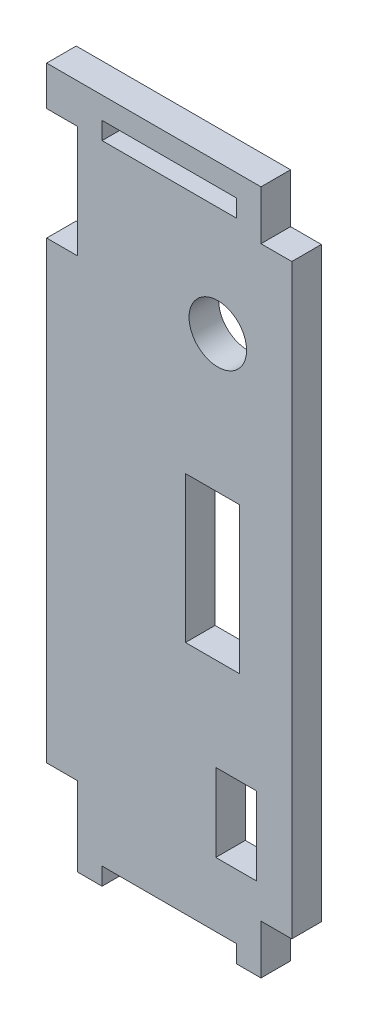
ISO-10303-21;
HEADER;
FILE_DESCRIPTION(('STEP AP214'),'2;1');
FILE_NAME('part.step','',(''),(''),'','','');
FILE_SCHEMA(('AUTOMOTIVE_DESIGN { 1 0 10303 214 1 1 1 1 }'));
ENDSEC;
DATA;
#1=APPLICATION_CONTEXT('core data for automotive mechanical design processes');
#2=APPLICATION_PROTOCOL_DEFINITION('international standard','automotive_design',2000,#1);
#3=PRODUCT_CONTEXT('',#1,'mechanical');
#4=PRODUCT('Part','Part','',(#3));
#5=PRODUCT_RELATED_PRODUCT_CATEGORY('part','',(#4));
#6=PRODUCT_DEFINITION_FORMATION('','',#4);
#7=PRODUCT_DEFINITION_CONTEXT('part definition',#1,'design');
#8=PRODUCT_DEFINITION('design','',#6,#7);
#9=PRODUCT_DEFINITION_SHAPE('','',#8);
#10=(LENGTH_UNIT() NAMED_UNIT(*) SI_UNIT(.MILLI.,.METRE.));
#11=(NAMED_UNIT(*) PLANE_ANGLE_UNIT() SI_UNIT($,.RADIAN.));
#12=(NAMED_UNIT(*) SI_UNIT($,.STERADIAN.) SOLID_ANGLE_UNIT());
#13=UNCERTAINTY_MEASURE_WITH_UNIT(LENGTH_MEASURE(1.E-05),#10,'distance_accuracy_value','');
#14=(GEOMETRIC_REPRESENTATION_CONTEXT(3) GLOBAL_UNCERTAINTY_ASSIGNED_CONTEXT((#13)) GLOBAL_UNIT_ASSIGNED_CONTEXT((#10,
#11,#12)) REPRESENTATION_CONTEXT('',''));
#15=CARTESIAN_POINT('',(0.,0.,0.));
#16=DIRECTION('',(0.,0.,1.));
#17=DIRECTION('',(1.,0.,0.));
#18=AXIS2_PLACEMENT_3D('',#15,#16,#17);
#19=CARTESIAN_POINT('',(19.558,0.,3.048));
#20=DIRECTION('',(-1.,0.,0.));
#21=DIRECTION('',(0.,0.,1.));
#22=AXIS2_PLACEMENT_3D('',#19,#20,#21);
#23=PLANE('',#22);
#24=DIRECTION('',(0.,1.,0.));
#25=VECTOR('',#24,1.);
#26=CARTESIAN_POINT('',(19.558,0.,0.));
#27=LINE('',#26,#25);
#28=CARTESIAN_POINT('',(19.558,64.77,0.));
#29=VERTEX_POINT('',#28);
#30=CARTESIAN_POINT('',(19.558,66.5734,0.));
#31=VERTEX_POINT('',#30);
#32=EDGE_CURVE('E331',#29,#31,#27,.T.);
#33=ORIENTED_EDGE('',*,*,#32,.F.);
#34=DIRECTION('',(0.,0.,-1.));
#35=VECTOR('',#34,1.);
#36=CARTESIAN_POINT('',(19.558,64.77,3.048));
#37=LINE('',#36,#35);
#38=CARTESIAN_POINT('',(19.558,64.77,3.048));
#39=VERTEX_POINT('',#38);
#40=EDGE_CURVE('E11',#39,#29,#37,.T.);
#41=ORIENTED_EDGE('',*,*,#40,.F.);
#42=DIRECTION('',(0.,1.,0.));
#43=VECTOR('',#42,1.);
#44=CARTESIAN_POINT('',(19.558,0.,3.048));
#45=LINE('',#44,#43);
#46=CARTESIAN_POINT('',(19.558,66.5734,3.048));
#47=VERTEX_POINT('',#46);
#48=EDGE_CURVE('E258',#39,#47,#45,.T.);
#49=ORIENTED_EDGE('',*,*,#48,.T.);
#50=DIRECTION('',(0.,0.,-1.));
#51=VECTOR('',#50,1.);
#52=CARTESIAN_POINT('',(19.558,66.5734,3.048));
#53=LINE('',#52,#51);
#54=EDGE_CURVE('E153',#47,#31,#53,.T.);
#55=ORIENTED_EDGE('',*,*,#54,.T.);
#56=EDGE_LOOP('',(#33,#41,#49,#55));
#57=FACE_BOUND('',#56,.T.);
#58=ADVANCED_FACE('F33',(#57),#23,.T.);
#59=CARTESIAN_POINT('',(0.,64.77,3.048));
#60=DIRECTION('',(0.,1.,0.));
#61=DIRECTION('',(0.,0.,1.));
#62=AXIS2_PLACEMENT_3D('',#59,#60,#61);
#63=PLANE('',#62);
#64=DIRECTION('',(1.,0.,0.));
#65=VECTOR('',#64,1.);
#66=CARTESIAN_POINT('',(0.,64.77,0.));
#67=LINE('',#66,#65);
#68=CARTESIAN_POINT('',(5.71499999999999,64.77,0.));
#69=VERTEX_POINT('',#68);
#70=EDGE_CURVE('E248',#69,#29,#67,.T.);
#71=ORIENTED_EDGE('',*,*,#70,.F.);
#72=DIRECTION('',(0.,0.,-1.));
#73=VECTOR('',#72,1.);
#74=CARTESIAN_POINT('',(5.71499999999999,64.77,3.048));
#75=LINE('',#74,#73);
#76=CARTESIAN_POINT('',(5.71499999999999,64.77,3.048));
#77=VERTEX_POINT('',#76);
#78=EDGE_CURVE('E43',#77,#69,#75,.T.);
#79=ORIENTED_EDGE('',*,*,#78,.F.);
#80=DIRECTION('',(1.,0.,0.));
#81=VECTOR('',#80,1.);
#82=CARTESIAN_POINT('',(0.,64.77,3.048));
#83=LINE('',#82,#81);
#84=EDGE_CURVE('E246',#77,#39,#83,.T.);
#85=ORIENTED_EDGE('',*,*,#84,.T.);
#86=ORIENTED_EDGE('',*,*,#40,.T.);
#87=EDGE_LOOP('',(#71,#79,#85,#86));
#88=FACE_BOUND('',#87,.T.);
#89=ADVANCED_FACE('F244',(#88),#63,.T.);
#90=CARTESIAN_POINT('',(5.71499999999996,0.,3.048));
#91=DIRECTION('',(-1.,0.,0.));
#92=DIRECTION('',(0.,-1.,0.));
#93=AXIS2_PLACEMENT_3D('',#90,#91,#92);
#94=PLANE('',#93);
#95=DIRECTION('',(0.,1.,0.));
#96=VECTOR('',#95,1.);
#97=CARTESIAN_POINT('',(5.71499999999996,0.,0.));
#98=LINE('',#97,#96);
#99=CARTESIAN_POINT('',(5.71499999999999,66.5734,0.));
#100=VERTEX_POINT('',#99);
#101=EDGE_CURVE('E334',#69,#100,#98,.T.);
#102=ORIENTED_EDGE('',*,*,#101,.T.);
#103=DIRECTION('',(0.,0.,-1.));
#104=VECTOR('',#103,1.);
#105=CARTESIAN_POINT('',(5.71499999999999,66.5734,3.048));
#106=LINE('',#105,#104);
#107=CARTESIAN_POINT('',(5.71499999999999,66.5734,3.048));
#108=VERTEX_POINT('',#107);
#109=EDGE_CURVE('E251',#108,#100,#106,.T.);
#110=ORIENTED_EDGE('',*,*,#109,.F.);
#111=DIRECTION('',(0.,1.,0.));
#112=VECTOR('',#111,1.);
#113=CARTESIAN_POINT('',(5.71499999999996,0.,3.048));
#114=LINE('',#113,#112);
#115=EDGE_CURVE('E254',#77,#108,#114,.T.);
#116=ORIENTED_EDGE('',*,*,#115,.F.);
#117=ORIENTED_EDGE('',*,*,#78,.T.);
#118=EDGE_LOOP('',(#102,#110,#116,#117));
#119=FACE_BOUND('',#118,.T.);
#120=ADVANCED_FACE('F255',(#119),#94,.F.);
#121=CARTESIAN_POINT('',(0.,6.62939999999999,3.048));
#122=DIRECTION('',(0.,1.,0.));
#123=DIRECTION('',(0.,0.,1.));
#124=AXIS2_PLACEMENT_3D('',#121,#122,#123);
#125=PLANE('',#124);
#126=DIRECTION('',(1.,0.,0.));
#127=VECTOR('',#126,1.);
#128=CARTESIAN_POINT('',(0.,6.62939999999999,0.));
#129=LINE('',#128,#127);
#130=CARTESIAN_POINT('',(17.4370999999999,6.62939999999999,0.));
#131=VERTEX_POINT('',#130);
#132=CARTESIAN_POINT('',(21.6153999999999,6.62939999999999,0.));
#133=VERTEX_POINT('',#132);
#134=EDGE_CURVE('E319',#131,#133,#129,.T.);
#135=ORIENTED_EDGE('',*,*,#134,.F.);
#136=DIRECTION('',(0.,0.,-1.));
#137=VECTOR('',#136,1.);
#138=CARTESIAN_POINT('',(17.4370999999999,6.62939999999999,3.048));
#139=LINE('',#138,#137);
#140=CARTESIAN_POINT('',(17.4370999999999,6.62939999999999,3.048));
#141=VERTEX_POINT('',#140);
#142=EDGE_CURVE('E339',#141,#131,#139,.T.);
#143=ORIENTED_EDGE('',*,*,#142,.F.);
#144=DIRECTION('',(1.,0.,0.));
#145=VECTOR('',#144,1.);
#146=CARTESIAN_POINT('',(0.,6.62939999999999,3.048));
#147=LINE('',#146,#145);
#148=CARTESIAN_POINT('',(21.6153999999999,6.62939999999999,3.048));
#149=VERTEX_POINT('',#148);
#150=EDGE_CURVE('E476',#141,#149,#147,.T.);
#151=ORIENTED_EDGE('',*,*,#150,.T.);
#152=DIRECTION('',(0.,0.,-1.));
#153=VECTOR('',#152,1.);
#154=CARTESIAN_POINT('',(21.6153999999999,6.62939999999999,3.048));
#155=LINE('',#154,#153);
#156=EDGE_CURVE('E341',#149,#133,#155,.T.);
#157=ORIENTED_EDGE('',*,*,#156,.T.);
#158=EDGE_LOOP('',(#135,#143,#151,#157));
#159=FACE_BOUND('',#158,.T.);
#160=ADVANCED_FACE('F499',(#159),#125,.T.);
#161=CARTESIAN_POINT('',(17.4370999999999,0.,3.048));
#162=DIRECTION('',(-1.,0.,0.));
#163=DIRECTION('',(0.,-1.,0.));
#164=AXIS2_PLACEMENT_3D('',#161,#162,#163);
#165=PLANE('',#164);
#166=DIRECTION('',(0.,1.,0.));
#167=VECTOR('',#166,1.);
#168=CARTESIAN_POINT('',(17.4370999999999,0.,0.));
#169=LINE('',#168,#167);
#170=CARTESIAN_POINT('',(17.4370999999999,14.6685,0.));
#171=VERTEX_POINT('',#170);
#172=EDGE_CURVE('E322',#131,#171,#169,.T.);
#173=ORIENTED_EDGE('',*,*,#172,.T.);
#174=DIRECTION('',(0.,0.,-1.));
#175=VECTOR('',#174,1.);
#176=CARTESIAN_POINT('',(17.4370999999999,14.6685,3.048));
#177=LINE('',#176,#175);
#178=CARTESIAN_POINT('',(17.4370999999999,14.6685,3.048));
#179=VERTEX_POINT('',#178);
#180=EDGE_CURVE('E346',#179,#171,#177,.T.);
#181=ORIENTED_EDGE('',*,*,#180,.F.);
#182=DIRECTION('',(0.,1.,0.));
#183=VECTOR('',#182,1.);
#184=CARTESIAN_POINT('',(17.4370999999999,0.,3.048));
#185=LINE('',#184,#183);
#186=EDGE_CURVE('E479',#141,#179,#185,.T.);
#187=ORIENTED_EDGE('',*,*,#186,.F.);
#188=ORIENTED_EDGE('',*,*,#142,.T.);
#189=EDGE_LOOP('',(#173,#181,#187,#188));
#190=FACE_BOUND('',#189,.T.);
#191=ADVANCED_FACE('F501',(#190),#165,.F.);
#192=CARTESIAN_POINT('',(0.,14.6685,3.048));
#193=DIRECTION('',(0.,1.,0.));
#194=DIRECTION('',(-1.,0.,0.));
#195=AXIS2_PLACEMENT_3D('',#192,#193,#194);
#196=PLANE('',#195);
#197=DIRECTION('',(1.,0.,0.));
#198=VECTOR('',#197,1.);
#199=CARTESIAN_POINT('',(0.,14.6685,0.));
#200=LINE('',#199,#198);
#201=CARTESIAN_POINT('',(21.6153999999999,14.6685,0.));
#202=VERTEX_POINT('',#201);
#203=EDGE_CURVE('E325',#171,#202,#200,.T.);
#204=ORIENTED_EDGE('',*,*,#203,.T.);
#205=DIRECTION('',(0.,0.,-1.));
#206=VECTOR('',#205,1.);
#207=CARTESIAN_POINT('',(21.6153999999999,14.6685,3.048));
#208=LINE('',#207,#206);
#209=CARTESIAN_POINT('',(21.6153999999999,14.6685,3.048));
#210=VERTEX_POINT('',#209);
#211=EDGE_CURVE('E343',#210,#202,#208,.T.);
#212=ORIENTED_EDGE('',*,*,#211,.F.);
#213=DIRECTION('',(1.,0.,0.));
#214=VECTOR('',#213,1.);
#215=CARTESIAN_POINT('',(0.,14.6685,3.048));
#216=LINE('',#215,#214);
#217=EDGE_CURVE('E482',#179,#210,#216,.T.);
#218=ORIENTED_EDGE('',*,*,#217,.F.);
#219=ORIENTED_EDGE('',*,*,#180,.T.);
#220=EDGE_LOOP('',(#204,#212,#218,#219));
#221=FACE_BOUND('',#220,.T.);
#222=ADVANCED_FACE('F494',(#221),#196,.F.);
#223=CARTESIAN_POINT('',(1.46568363506623E-13,39.3446000000001,3.048));
#224=DIRECTION('',(0.,-1.,0.));
#225=DIRECTION('',(1.,0.,0.));
#226=AXIS2_PLACEMENT_3D('',#223,#224,#225);
#227=PLANE('',#226);
#228=DIRECTION('',(-1.,0.,0.));
#229=VECTOR('',#228,1.);
#230=CARTESIAN_POINT('',(1.46568363506623E-13,39.3446000000001,0.));
#231=LINE('',#230,#229);
#232=CARTESIAN_POINT('',(19.9009,39.3446,0.));
#233=VERTEX_POINT('',#232);
#234=CARTESIAN_POINT('',(14.3129,39.3446,0.));
#235=VERTEX_POINT('',#234);
#236=EDGE_CURVE('E307',#233,#235,#231,.T.);
#237=ORIENTED_EDGE('',*,*,#236,.F.);
#238=DIRECTION('',(0.,0.,-1.));
#239=VECTOR('',#238,1.);
#240=CARTESIAN_POINT('',(19.9009,39.3446,3.048));
#241=LINE('',#240,#239);
#242=CARTESIAN_POINT('',(19.9009,39.3446,3.048));
#243=VERTEX_POINT('',#242);
#244=EDGE_CURVE('E344',#243,#233,#241,.T.);
#245=ORIENTED_EDGE('',*,*,#244,.F.);
#246=DIRECTION('',(-1.,0.,0.));
#247=VECTOR('',#246,1.);
#248=CARTESIAN_POINT('',(1.46568363506623E-13,39.3446000000001,3.048));
#249=LINE('',#248,#247);
#250=CARTESIAN_POINT('',(14.3129,39.3446,3.048));
#251=VERTEX_POINT('',#250);
#252=EDGE_CURVE('E465',#243,#251,#249,.T.);
#253=ORIENTED_EDGE('',*,*,#252,.T.);
#254=DIRECTION('',(0.,0.,-1.));
#255=VECTOR('',#254,1.);
#256=CARTESIAN_POINT('',(14.3129,39.3446,3.048));
#257=LINE('',#256,#255);
#258=EDGE_CURVE('E350',#251,#235,#257,.T.);
#259=ORIENTED_EDGE('',*,*,#258,.T.);
#260=EDGE_LOOP('',(#237,#245,#253,#259));
#261=FACE_BOUND('',#260,.T.);
#262=ADVANCED_FACE('F508',(#261),#227,.T.);
#263=CARTESIAN_POINT('',(19.9008999999999,0.,3.048));
#264=DIRECTION('',(-1.,0.,0.));
#265=DIRECTION('',(0.,-1.,0.));
#266=AXIS2_PLACEMENT_3D('',#263,#264,#265);
#267=PLANE('',#266);
#268=DIRECTION('',(0.,1.,0.));
#269=VECTOR('',#268,1.);
#270=CARTESIAN_POINT('',(19.9008999999999,0.,0.));
#271=LINE('',#270,#269);
#272=CARTESIAN_POINT('',(19.9009,24.257,0.));
#273=VERTEX_POINT('',#272);
#274=EDGE_CURVE('E310',#273,#233,#271,.T.);
#275=ORIENTED_EDGE('',*,*,#274,.F.);
#276=DIRECTION('',(0.,0.,-1.));
#277=VECTOR('',#276,1.);
#278=CARTESIAN_POINT('',(19.9009,24.257,3.048));
#279=LINE('',#278,#277);
#280=CARTESIAN_POINT('',(19.9009,24.257,3.048));
#281=VERTEX_POINT('',#280);
#282=EDGE_CURVE('E355',#281,#273,#279,.T.);
#283=ORIENTED_EDGE('',*,*,#282,.F.);
#284=DIRECTION('',(0.,1.,0.));
#285=VECTOR('',#284,1.);
#286=CARTESIAN_POINT('',(19.9008999999999,0.,3.048));
#287=LINE('',#286,#285);
#288=EDGE_CURVE('E468',#281,#243,#287,.T.);
#289=ORIENTED_EDGE('',*,*,#288,.T.);
#290=ORIENTED_EDGE('',*,*,#244,.T.);
#291=EDGE_LOOP('',(#275,#283,#289,#290));
#292=FACE_BOUND('',#291,.T.);
#293=ADVANCED_FACE('F593',(#292),#267,.T.);
#294=CARTESIAN_POINT('',(0.,24.257,3.048));
#295=DIRECTION('',(0.,-1.,0.));
#296=DIRECTION('',(1.,0.,0.));
#297=AXIS2_PLACEMENT_3D('',#294,#295,#296);
#298=PLANE('',#297);
#299=DIRECTION('',(-1.,0.,0.));
#300=VECTOR('',#299,1.);
#301=CARTESIAN_POINT('',(0.,24.257,0.));
#302=LINE('',#301,#300);
#303=CARTESIAN_POINT('',(14.3129,24.257,0.));
#304=VERTEX_POINT('',#303);
#305=EDGE_CURVE('E313',#273,#304,#302,.T.);
#306=ORIENTED_EDGE('',*,*,#305,.T.);
#307=DIRECTION('',(0.,0.,-1.));
#308=VECTOR('',#307,1.);
#309=CARTESIAN_POINT('',(14.3129,24.257,3.048));
#310=LINE('',#309,#308);
#311=CARTESIAN_POINT('',(14.3129,24.257,3.048));
#312=VERTEX_POINT('',#311);
#313=EDGE_CURVE('E352',#312,#304,#310,.T.);
#314=ORIENTED_EDGE('',*,*,#313,.F.);
#315=DIRECTION('',(-1.,0.,0.));
#316=VECTOR('',#315,1.);
#317=CARTESIAN_POINT('',(0.,24.257,3.048));
#318=LINE('',#317,#316);
#319=EDGE_CURVE('E471',#281,#312,#318,.T.);
#320=ORIENTED_EDGE('',*,*,#319,.F.);
#321=ORIENTED_EDGE('',*,*,#282,.T.);
#322=EDGE_LOOP('',(#306,#314,#320,#321));
#323=FACE_BOUND('',#322,.T.);
#324=ADVANCED_FACE('F589',(#323),#298,.F.);
#325=CARTESIAN_POINT('',(0.,63.754,3.048));
#326=DIRECTION('',(0.,-1.,0.));
#327=DIRECTION('',(0.,0.,-1.));
#328=AXIS2_PLACEMENT_3D('',#325,#326,#327);
#329=PLANE('',#328);
#330=DIRECTION('',(-1.,0.,0.));
#331=VECTOR('',#330,1.);
#332=CARTESIAN_POINT('',(0.,63.754,0.));
#333=LINE('',#332,#331);
#334=CARTESIAN_POINT('',(25.273,63.754,0.));
#335=VERTEX_POINT('',#334);
#336=CARTESIAN_POINT('',(22.098,63.754,0.));
#337=VERTEX_POINT('',#336);
#338=EDGE_CURVE('E266',#335,#337,#333,.T.);
#339=ORIENTED_EDGE('',*,*,#338,.T.);
#340=DIRECTION('',(0.,0.,-1.));
#341=VECTOR('',#340,1.);
#342=CARTESIAN_POINT('',(22.098,63.754,3.048));
#343=LINE('',#342,#341);
#344=CARTESIAN_POINT('',(22.098,63.754,3.048));
#345=VERTEX_POINT('',#344);
#346=EDGE_CURVE('E37',#345,#337,#343,.T.);
#347=ORIENTED_EDGE('',*,*,#346,.F.);
#348=DIRECTION('',(-1.,0.,0.));
#349=VECTOR('',#348,1.);
#350=CARTESIAN_POINT('',(0.,63.754,3.048));
#351=LINE('',#350,#349);
#352=CARTESIAN_POINT('',(25.273,63.754,3.048));
#353=VERTEX_POINT('',#352);
#354=EDGE_CURVE('E337',#353,#345,#351,.T.);
#355=ORIENTED_EDGE('',*,*,#354,.F.);
#356=DIRECTION('',(0.,0.,-1.));
#357=VECTOR('',#356,1.);
#358=CARTESIAN_POINT('',(25.273,63.754,3.048));
#359=LINE('',#358,#357);
#360=EDGE_CURVE('E265',#353,#335,#359,.T.);
#361=ORIENTED_EDGE('',*,*,#360,.T.);
#362=EDGE_LOOP('',(#339,#347,#355,#361));
#363=FACE_BOUND('',#362,.T.);
#364=ADVANCED_FACE('F35',(#363),#329,.F.);
#365=CARTESIAN_POINT('',(22.098,0.,3.048));
#366=DIRECTION('',(-1.,0.,0.));
#367=DIRECTION('',(0.,0.,1.));
#368=AXIS2_PLACEMENT_3D('',#365,#366,#367);
#369=PLANE('',#368);
#370=DIRECTION('',(0.,1.,0.));
#371=VECTOR('',#370,1.);
#372=CARTESIAN_POINT('',(22.098,0.,0.));
#373=LINE('',#372,#371);
#374=CARTESIAN_POINT('',(22.098,68.834,0.));
#375=VERTEX_POINT('',#374);
#376=EDGE_CURVE('E269',#337,#375,#373,.T.);
#377=ORIENTED_EDGE('',*,*,#376,.T.);
#378=DIRECTION('',(0.,0.,-1.));
#379=VECTOR('',#378,1.);
#380=CARTESIAN_POINT('',(22.098,68.834,3.048));
#381=LINE('',#380,#379);
#382=CARTESIAN_POINT('',(22.098,68.834,3.048));
#383=VERTEX_POINT('',#382);
#384=EDGE_CURVE('E402',#383,#375,#381,.T.);
#385=ORIENTED_EDGE('',*,*,#384,.F.);
#386=DIRECTION('',(0.,1.,0.));
#387=VECTOR('',#386,1.);
#388=CARTESIAN_POINT('',(22.098,0.,3.048));
#389=LINE('',#388,#387);
#390=EDGE_CURVE('E161',#345,#383,#389,.T.);
#391=ORIENTED_EDGE('',*,*,#390,.F.);
#392=ORIENTED_EDGE('',*,*,#346,.T.);
#393=EDGE_LOOP('',(#377,#385,#391,#392));
#394=FACE_BOUND('',#393,.T.);
#395=ADVANCED_FACE('F408',(#394),#369,.F.);
#396=CARTESIAN_POINT('',(0.,68.834,3.048));
#397=DIRECTION('',(0.,-1.,0.));
#398=DIRECTION('',(0.,0.,-1.));
#399=AXIS2_PLACEMENT_3D('',#396,#397,#398);
#400=PLANE('',#399);
#401=DIRECTION('',(-1.,0.,0.));
#402=VECTOR('',#401,1.);
#403=CARTESIAN_POINT('',(0.,68.834,0.));
#404=LINE('',#403,#402);
#405=CARTESIAN_POINT('',(0.,68.834,0.));
#406=VERTEX_POINT('',#405);
#407=EDGE_CURVE('E271',#375,#406,#404,.T.);
#408=ORIENTED_EDGE('',*,*,#407,.T.);
#409=DIRECTION('',(0.,0.,-1.));
#410=VECTOR('',#409,1.);
#411=CARTESIAN_POINT('',(0.,68.834,3.048));
#412=LINE('',#411,#410);
#413=CARTESIAN_POINT('',(0.,68.834,3.048));
#414=VERTEX_POINT('',#413);
#415=EDGE_CURVE('E400',#414,#406,#412,.T.);
#416=ORIENTED_EDGE('',*,*,#415,.F.);
#417=DIRECTION('',(-1.,0.,0.));
#418=VECTOR('',#417,1.);
#419=CARTESIAN_POINT('',(0.,68.834,3.048));
#420=LINE('',#419,#418);
#421=EDGE_CURVE('E430',#383,#414,#420,.T.);
#422=ORIENTED_EDGE('',*,*,#421,.F.);
#423=ORIENTED_EDGE('',*,*,#384,.T.);
#424=EDGE_LOOP('',(#408,#416,#422,#423));
#425=FACE_BOUND('',#424,.T.);
#426=ADVANCED_FACE('F421',(#425),#400,.F.);
#427=CARTESIAN_POINT('',(0.,0.,3.048));
#428=DIRECTION('',(1.,0.,0.));
#429=DIRECTION('',(0.,1.,0.));
#430=AXIS2_PLACEMENT_3D('',#427,#428,#429);
#431=PLANE('',#430);
#432=DIRECTION('',(0.,-1.,0.));
#433=VECTOR('',#432,1.);
#434=CARTESIAN_POINT('',(0.,0.,0.));
#435=LINE('',#434,#433);
#436=CARTESIAN_POINT('',(0.,64.77,0.));
#437=VERTEX_POINT('',#436);
#438=EDGE_CURVE('E273',#406,#437,#435,.T.);
#439=ORIENTED_EDGE('',*,*,#438,.T.);
#440=DIRECTION('',(0.,0.,-1.));
#441=VECTOR('',#440,1.);
#442=CARTESIAN_POINT('',(0.,64.77,3.048));
#443=LINE('',#442,#441);
#444=CARTESIAN_POINT('',(0.,64.77,3.048));
#445=VERTEX_POINT('',#444);
#446=EDGE_CURVE('E397',#445,#437,#443,.T.);
#447=ORIENTED_EDGE('',*,*,#446,.F.);
#448=DIRECTION('',(0.,-1.,0.));
#449=VECTOR('',#448,1.);
#450=CARTESIAN_POINT('',(0.,0.,3.048));
#451=LINE('',#450,#449);
#452=EDGE_CURVE('E426',#414,#445,#451,.T.);
#453=ORIENTED_EDGE('',*,*,#452,.F.);
#454=ORIENTED_EDGE('',*,*,#415,.T.);
#455=EDGE_LOOP('',(#439,#447,#453,#454));
#456=FACE_BOUND('',#455,.T.);
#457=ADVANCED_FACE('F424',(#456),#431,.F.);
#458=CARTESIAN_POINT('',(0.,64.77,3.048));
#459=DIRECTION('',(0.,1.,0.));
#460=DIRECTION('',(0.,0.,1.));
#461=AXIS2_PLACEMENT_3D('',#458,#459,#460);
#462=PLANE('',#461);
#463=DIRECTION('',(1.,0.,0.));
#464=VECTOR('',#463,1.);
#465=CARTESIAN_POINT('',(0.,64.77,0.));
#466=LINE('',#465,#464);
#467=CARTESIAN_POINT('',(3.17499999999999,64.77,0.));
#468=VERTEX_POINT('',#467);
#469=EDGE_CURVE('E275',#437,#468,#466,.T.);
#470=ORIENTED_EDGE('',*,*,#469,.T.);
#471=DIRECTION('',(0.,0.,-1.));
#472=VECTOR('',#471,1.);
#473=CARTESIAN_POINT('',(3.17499999999999,64.77,3.048));
#474=LINE('',#473,#472);
#475=CARTESIAN_POINT('',(3.17499999999999,64.77,3.048));
#476=VERTEX_POINT('',#475);
#477=EDGE_CURVE('E394',#476,#468,#474,.T.);
#478=ORIENTED_EDGE('',*,*,#477,.F.);
#479=DIRECTION('',(1.,0.,0.));
#480=VECTOR('',#479,1.);
#481=CARTESIAN_POINT('',(0.,64.77,3.048));
#482=LINE('',#481,#480);
#483=EDGE_CURVE('E429',#445,#476,#482,.T.);
#484=ORIENTED_EDGE('',*,*,#483,.F.);
#485=ORIENTED_EDGE('',*,*,#446,.T.);
#486=EDGE_LOOP('',(#470,#478,#484,#485));
#487=FACE_BOUND('',#486,.T.);
#488=ADVANCED_FACE('F577',(#487),#462,.F.);
#489=CARTESIAN_POINT('',(3.17500000000003,0.,3.048));
#490=DIRECTION('',(1.,0.,0.));
#491=DIRECTION('',(0.,1.,0.));
#492=AXIS2_PLACEMENT_3D('',#489,#490,#491);
#493=PLANE('',#492);
#494=DIRECTION('',(0.,-1.,0.));
#495=VECTOR('',#494,1.);
#496=CARTESIAN_POINT('',(3.17500000000003,0.,0.));
#497=LINE('',#496,#495);
#498=CARTESIAN_POINT('',(3.175,53.213,0.));
#499=VERTEX_POINT('',#498);
#500=EDGE_CURVE('E277',#468,#499,#497,.T.);
#501=ORIENTED_EDGE('',*,*,#500,.T.);
#502=DIRECTION('',(0.,0.,-1.));
#503=VECTOR('',#502,1.);
#504=CARTESIAN_POINT('',(3.175,53.213,3.048));
#505=LINE('',#504,#503);
#506=CARTESIAN_POINT('',(3.175,53.213,3.048));
#507=VERTEX_POINT('',#506);
#508=EDGE_CURVE('E391',#507,#499,#505,.T.);
#509=ORIENTED_EDGE('',*,*,#508,.F.);
#510=DIRECTION('',(0.,-1.,0.));
#511=VECTOR('',#510,1.);
#512=CARTESIAN_POINT('',(3.17500000000003,0.,3.048));
#513=LINE('',#512,#511);
#514=EDGE_CURVE('E432',#476,#507,#513,.T.);
#515=ORIENTED_EDGE('',*,*,#514,.F.);
#516=ORIENTED_EDGE('',*,*,#477,.T.);
#517=EDGE_LOOP('',(#501,#509,#515,#516));
#518=FACE_BOUND('',#517,.T.);
#519=ADVANCED_FACE('F573',(#518),#493,.F.);
#520=CARTESIAN_POINT('',(0.,53.213,3.048));
#521=DIRECTION('',(0.,-1.,0.));
#522=DIRECTION('',(0.,0.,-1.));
#523=AXIS2_PLACEMENT_3D('',#520,#521,#522);
#524=PLANE('',#523);
#525=DIRECTION('',(-1.,0.,0.));
#526=VECTOR('',#525,1.);
#527=CARTESIAN_POINT('',(0.,53.213,0.));
#528=LINE('',#527,#526);
#529=CARTESIAN_POINT('',(0.,53.213,0.));
#530=VERTEX_POINT('',#529);
#531=EDGE_CURVE('E279',#499,#530,#528,.T.);
#532=ORIENTED_EDGE('',*,*,#531,.T.);
#533=DIRECTION('',(0.,0.,-1.));
#534=VECTOR('',#533,1.);
#535=CARTESIAN_POINT('',(0.,53.213,3.048));
#536=LINE('',#535,#534);
#537=CARTESIAN_POINT('',(0.,53.213,3.048));
#538=VERTEX_POINT('',#537);
#539=EDGE_CURVE('E388',#538,#530,#536,.T.);
#540=ORIENTED_EDGE('',*,*,#539,.F.);
#541=DIRECTION('',(-1.,0.,0.));
#542=VECTOR('',#541,1.);
#543=CARTESIAN_POINT('',(0.,53.213,3.048));
#544=LINE('',#543,#542);
#545=EDGE_CURVE('E438',#507,#538,#544,.T.);
#546=ORIENTED_EDGE('',*,*,#545,.F.);
#547=ORIENTED_EDGE('',*,*,#508,.T.);
#548=EDGE_LOOP('',(#532,#540,#546,#547));
#549=FACE_BOUND('',#548,.T.);
#550=ADVANCED_FACE('F569',(#549),#524,.F.);
#551=CARTESIAN_POINT('',(0.,0.,3.048));
#552=DIRECTION('',(1.,0.,0.));
#553=DIRECTION('',(0.,0.,-1.));
#554=AXIS2_PLACEMENT_3D('',#551,#552,#553);
#555=PLANE('',#554);
#556=DIRECTION('',(0.,-1.,0.));
#557=VECTOR('',#556,1.);
#558=CARTESIAN_POINT('',(0.,0.,0.));
#559=LINE('',#558,#557);
#560=CARTESIAN_POINT('',(0.,6.35,0.));
#561=VERTEX_POINT('',#560);
#562=EDGE_CURVE('E281',#530,#561,#559,.T.);
#563=ORIENTED_EDGE('',*,*,#562,.T.);
#564=DIRECTION('',(0.,0.,-1.));
#565=VECTOR('',#564,1.);
#566=CARTESIAN_POINT('',(0.,6.35,3.048));
#567=LINE('',#566,#565);
#568=CARTESIAN_POINT('',(0.,6.35,3.048));
#569=VERTEX_POINT('',#568);
#570=EDGE_CURVE('E386',#569,#561,#567,.T.);
#571=ORIENTED_EDGE('',*,*,#570,.F.);
#572=DIRECTION('',(0.,-1.,0.));
#573=VECTOR('',#572,1.);
#574=CARTESIAN_POINT('',(0.,0.,3.048));
#575=LINE('',#574,#573);
#576=EDGE_CURVE('E440',#538,#569,#575,.T.);
#577=ORIENTED_EDGE('',*,*,#576,.F.);
#578=ORIENTED_EDGE('',*,*,#539,.T.);
#579=EDGE_LOOP('',(#563,#571,#577,#578));
#580=FACE_BOUND('',#579,.T.);
#581=ADVANCED_FACE('F565',(#580),#555,.F.);
#582=CARTESIAN_POINT('',(0.,6.35,3.048));
#583=DIRECTION('',(0.,-1.,0.));
#584=DIRECTION('',(0.,0.,-1.));
#585=AXIS2_PLACEMENT_3D('',#582,#583,#584);
#586=PLANE('',#585);
#587=DIRECTION('',(-1.,0.,0.));
#588=VECTOR('',#587,1.);
#589=CARTESIAN_POINT('',(0.,6.35,0.));
#590=LINE('',#589,#588);
#591=CARTESIAN_POINT('',(3.175,6.35,0.));
#592=VERTEX_POINT('',#591);
#593=EDGE_CURVE('E284',#592,#561,#590,.T.);
#594=ORIENTED_EDGE('',*,*,#593,.F.);
#595=DIRECTION('',(0.,0.,-1.));
#596=VECTOR('',#595,1.);
#597=CARTESIAN_POINT('',(3.175,6.35,3.048));
#598=LINE('',#597,#596);
#599=CARTESIAN_POINT('',(3.175,6.35,3.048));
#600=VERTEX_POINT('',#599);
#601=EDGE_CURVE('E384',#600,#592,#598,.T.);
#602=ORIENTED_EDGE('',*,*,#601,.F.);
#603=DIRECTION('',(-1.,0.,0.));
#604=VECTOR('',#603,1.);
#605=CARTESIAN_POINT('',(0.,6.35,3.048));
#606=LINE('',#605,#604);
#607=EDGE_CURVE('E442',#600,#569,#606,.T.);
#608=ORIENTED_EDGE('',*,*,#607,.T.);
#609=ORIENTED_EDGE('',*,*,#570,.T.);
#610=EDGE_LOOP('',(#594,#602,#608,#609));
#611=FACE_BOUND('',#610,.T.);
#612=ADVANCED_FACE('F561',(#611),#586,.T.);
#613=CARTESIAN_POINT('',(3.175,0.,3.048));
#614=DIRECTION('',(1.,0.,0.));
#615=DIRECTION('',(0.,0.,-1.));
#616=AXIS2_PLACEMENT_3D('',#613,#614,#615);
#617=PLANE('',#616);
#618=DIRECTION('',(0.,-1.,0.));
#619=VECTOR('',#618,1.);
#620=CARTESIAN_POINT('',(3.175,0.,0.));
#621=LINE('',#620,#619);
#622=CARTESIAN_POINT('',(3.175,-1.80339999999998,0.));
#623=VERTEX_POINT('',#622);
#624=EDGE_CURVE('E287',#592,#623,#621,.T.);
#625=ORIENTED_EDGE('',*,*,#624,.T.);
#626=DIRECTION('',(0.,0.,-1.));
#627=VECTOR('',#626,1.);
#628=CARTESIAN_POINT('',(3.175,-1.80339999999998,3.048));
#629=LINE('',#628,#627);
#630=CARTESIAN_POINT('',(3.175,-1.80339999999998,3.048));
#631=VERTEX_POINT('',#630);
#632=EDGE_CURVE('E381',#631,#623,#629,.T.);
#633=ORIENTED_EDGE('',*,*,#632,.F.);
#634=DIRECTION('',(0.,-1.,0.));
#635=VECTOR('',#634,1.);
#636=CARTESIAN_POINT('',(3.175,0.,3.048));
#637=LINE('',#636,#635);
#638=EDGE_CURVE('E445',#600,#631,#637,.T.);
#639=ORIENTED_EDGE('',*,*,#638,.F.);
#640=ORIENTED_EDGE('',*,*,#601,.T.);
#641=EDGE_LOOP('',(#625,#633,#639,#640));
#642=FACE_BOUND('',#641,.T.);
#643=ADVANCED_FACE('F558',(#642),#617,.F.);
#644=CARTESIAN_POINT('',(0.,-1.80339999999998,3.048));
#645=DIRECTION('',(0.,1.,0.));
#646=DIRECTION('',(0.,0.,1.));
#647=AXIS2_PLACEMENT_3D('',#644,#645,#646);
#648=PLANE('',#647);
#649=DIRECTION('',(1.,0.,0.));
#650=VECTOR('',#649,1.);
#651=CARTESIAN_POINT('',(0.,-1.80339999999998,0.));
#652=LINE('',#651,#650);
#653=CARTESIAN_POINT('',(5.715,-1.80339999999998,0.));
#654=VERTEX_POINT('',#653);
#655=EDGE_CURVE('E289',#623,#654,#652,.T.);
#656=ORIENTED_EDGE('',*,*,#655,.T.);
#657=DIRECTION('',(0.,0.,-1.));
#658=VECTOR('',#657,1.);
#659=CARTESIAN_POINT('',(5.715,-1.80339999999998,3.048));
#660=LINE('',#659,#658);
#661=CARTESIAN_POINT('',(5.715,-1.80339999999998,3.048));
#662=VERTEX_POINT('',#661);
#663=EDGE_CURVE('E378',#662,#654,#660,.T.);
#664=ORIENTED_EDGE('',*,*,#663,.F.);
#665=DIRECTION('',(1.,0.,0.));
#666=VECTOR('',#665,1.);
#667=CARTESIAN_POINT('',(0.,-1.80339999999998,3.048));
#668=LINE('',#667,#666);
#669=EDGE_CURVE('E447',#631,#662,#668,.T.);
#670=ORIENTED_EDGE('',*,*,#669,.F.);
#671=ORIENTED_EDGE('',*,*,#632,.T.);
#672=EDGE_LOOP('',(#656,#664,#670,#671));
#673=FACE_BOUND('',#672,.T.);
#674=ADVANCED_FACE('F546',(#673),#648,.F.);
#675=CARTESIAN_POINT('',(5.715,0.,3.048));
#676=DIRECTION('',(-1.,0.,0.));
#677=DIRECTION('',(0.,0.,1.));
#678=AXIS2_PLACEMENT_3D('',#675,#676,#677);
#679=PLANE('',#678);
#680=DIRECTION('',(0.,1.,0.));
#681=VECTOR('',#680,1.);
#682=CARTESIAN_POINT('',(5.715,0.,0.));
#683=LINE('',#682,#681);
#684=CARTESIAN_POINT('',(5.715,0.,0.));
#685=VERTEX_POINT('',#684);
#686=EDGE_CURVE('E291',#654,#685,#683,.T.);
#687=ORIENTED_EDGE('',*,*,#686,.T.);
#688=DIRECTION('',(0.,0.,-1.));
#689=VECTOR('',#688,1.);
#690=CARTESIAN_POINT('',(5.715,0.,3.048));
#691=LINE('',#690,#689);
#692=CARTESIAN_POINT('',(5.715,0.,3.048));
#693=VERTEX_POINT('',#692);
#694=EDGE_CURVE('E375',#693,#685,#691,.T.);
#695=ORIENTED_EDGE('',*,*,#694,.F.);
#696=DIRECTION('',(0.,1.,0.));
#697=VECTOR('',#696,1.);
#698=CARTESIAN_POINT('',(5.715,0.,3.048));
#699=LINE('',#698,#697);
#700=EDGE_CURVE('E449',#662,#693,#699,.T.);
#701=ORIENTED_EDGE('',*,*,#700,.F.);
#702=ORIENTED_EDGE('',*,*,#663,.T.);
#703=EDGE_LOOP('',(#687,#695,#701,#702));
#704=FACE_BOUND('',#703,.T.);
#705=ADVANCED_FACE('F553',(#704),#679,.F.);
#706=CARTESIAN_POINT('',(0.,0.,3.048));
#707=DIRECTION('',(0.,1.,0.));
#708=DIRECTION('',(0.,0.,1.));
#709=AXIS2_PLACEMENT_3D('',#706,#707,#708);
#710=PLANE('',#709);
#711=DIRECTION('',(1.,0.,0.));
#712=VECTOR('',#711,1.);
#713=CARTESIAN_POINT('',(0.,0.,0.));
#714=LINE('',#713,#712);
#715=CARTESIAN_POINT('',(19.558,0.,0.));
#716=VERTEX_POINT('',#715);
#717=EDGE_CURVE('E294',#685,#716,#714,.T.);
#718=ORIENTED_EDGE('',*,*,#717,.T.);
#719=DIRECTION('',(0.,0.,-1.));
#720=VECTOR('',#719,1.);
#721=CARTESIAN_POINT('',(19.558,0.,3.048));
#722=LINE('',#721,#720);
#723=CARTESIAN_POINT('',(19.558,0.,3.048));
#724=VERTEX_POINT('',#723);
#725=EDGE_CURVE('E372',#724,#716,#722,.T.);
#726=ORIENTED_EDGE('',*,*,#725,.F.);
#727=DIRECTION('',(1.,0.,0.));
#728=VECTOR('',#727,1.);
#729=CARTESIAN_POINT('',(0.,0.,3.048));
#730=LINE('',#729,#728);
#731=EDGE_CURVE('E452',#693,#724,#730,.T.);
#732=ORIENTED_EDGE('',*,*,#731,.F.);
#733=ORIENTED_EDGE('',*,*,#694,.T.);
#734=EDGE_LOOP('',(#718,#726,#732,#733));
#735=FACE_BOUND('',#734,.T.);
#736=ADVANCED_FACE('F549',(#735),#710,.F.);
#737=CARTESIAN_POINT('',(19.558,0.,3.048));
#738=DIRECTION('',(1.,0.,0.));
#739=DIRECTION('',(0.,0.,-1.));
#740=AXIS2_PLACEMENT_3D('',#737,#738,#739);
#741=PLANE('',#740);
#742=DIRECTION('',(0.,-1.,0.));
#743=VECTOR('',#742,1.);
#744=CARTESIAN_POINT('',(19.558,0.,0.));
#745=LINE('',#744,#743);
#746=CARTESIAN_POINT('',(19.558,-1.80339999999998,0.));
#747=VERTEX_POINT('',#746);
#748=EDGE_CURVE('E296',#716,#747,#745,.T.);
#749=ORIENTED_EDGE('',*,*,#748,.T.);
#750=DIRECTION('',(0.,0.,-1.));
#751=VECTOR('',#750,1.);
#752=CARTESIAN_POINT('',(19.558,-1.80339999999998,3.048));
#753=LINE('',#752,#751);
#754=CARTESIAN_POINT('',(19.558,-1.80339999999998,3.048));
#755=VERTEX_POINT('',#754);
#756=EDGE_CURVE('E369',#755,#747,#753,.T.);
#757=ORIENTED_EDGE('',*,*,#756,.F.);
#758=DIRECTION('',(0.,-1.,0.));
#759=VECTOR('',#758,1.);
#760=CARTESIAN_POINT('',(19.558,0.,3.048));
#761=LINE('',#760,#759);
#762=EDGE_CURVE('E454',#724,#755,#761,.T.);
#763=ORIENTED_EDGE('',*,*,#762,.F.);
#764=ORIENTED_EDGE('',*,*,#725,.T.);
#765=EDGE_LOOP('',(#749,#757,#763,#764));
#766=FACE_BOUND('',#765,.T.);
#767=ADVANCED_FACE('F544',(#766),#741,.F.);
#768=CARTESIAN_POINT('',(22.098,-1.80339999999998,0.));
#769=VERTEX_POINT('',#768);
#770=EDGE_CURVE('E292',#747,#769,#652,.T.);
#771=ORIENTED_EDGE('',*,*,#770,.T.);
#772=DIRECTION('',(0.,0.,-1.));
#773=VECTOR('',#772,1.);
#774=CARTESIAN_POINT('',(22.098,-1.80339999999998,3.048));
#775=LINE('',#774,#773);
#776=CARTESIAN_POINT('',(22.098,-1.80339999999998,3.048));
#777=VERTEX_POINT('',#776);
#778=EDGE_CURVE('E366',#777,#769,#775,.T.);
#779=ORIENTED_EDGE('',*,*,#778,.F.);
#780=EDGE_CURVE('E450',#755,#777,#668,.T.);
#781=ORIENTED_EDGE('',*,*,#780,.F.);
#782=ORIENTED_EDGE('',*,*,#756,.T.);
#783=EDGE_LOOP('',(#771,#779,#781,#782));
#784=FACE_BOUND('',#783,.T.);
#785=ADVANCED_FACE('F535',(#784),#648,.F.);
#786=CARTESIAN_POINT('',(22.098,0.,3.048));
#787=DIRECTION('',(-1.,0.,0.));
#788=DIRECTION('',(0.,0.,1.));
#789=AXIS2_PLACEMENT_3D('',#786,#787,#788);
#790=PLANE('',#789);
#791=DIRECTION('',(0.,1.,0.));
#792=VECTOR('',#791,1.);
#793=CARTESIAN_POINT('',(22.098,0.,0.));
#794=LINE('',#793,#792);
#795=CARTESIAN_POINT('',(22.098,3.27660000000002,0.));
#796=VERTEX_POINT('',#795);
#797=EDGE_CURVE('E298',#769,#796,#794,.T.);
#798=ORIENTED_EDGE('',*,*,#797,.T.);
#799=DIRECTION('',(0.,0.,-1.));
#800=VECTOR('',#799,1.);
#801=CARTESIAN_POINT('',(22.098,3.27660000000002,3.048));
#802=LINE('',#801,#800);
#803=CARTESIAN_POINT('',(22.098,3.27660000000002,3.048));
#804=VERTEX_POINT('',#803);
#805=EDGE_CURVE('E363',#804,#796,#802,.T.);
#806=ORIENTED_EDGE('',*,*,#805,.F.);
#807=DIRECTION('',(0.,1.,0.));
#808=VECTOR('',#807,1.);
#809=CARTESIAN_POINT('',(22.098,0.,3.048));
#810=LINE('',#809,#808);
#811=EDGE_CURVE('E456',#777,#804,#810,.T.);
#812=ORIENTED_EDGE('',*,*,#811,.F.);
#813=ORIENTED_EDGE('',*,*,#778,.T.);
#814=EDGE_LOOP('',(#798,#806,#812,#813));
#815=FACE_BOUND('',#814,.T.);
#816=ADVANCED_FACE('F529',(#815),#790,.F.);
#817=CARTESIAN_POINT('',(0.,3.27660000000001,3.048));
#818=DIRECTION('',(0.,1.,0.));
#819=DIRECTION('',(-1.,0.,0.));
#820=AXIS2_PLACEMENT_3D('',#817,#818,#819);
#821=PLANE('',#820);
#822=DIRECTION('',(1.,0.,0.));
#823=VECTOR('',#822,1.);
#824=CARTESIAN_POINT('',(0.,3.27660000000001,0.));
#825=LINE('',#824,#823);
#826=CARTESIAN_POINT('',(25.273,3.27660000000002,0.));
#827=VERTEX_POINT('',#826);
#828=EDGE_CURVE('E300',#796,#827,#825,.T.);
#829=ORIENTED_EDGE('',*,*,#828,.T.);
#830=DIRECTION('',(0.,0.,-1.));
#831=VECTOR('',#830,1.);
#832=CARTESIAN_POINT('',(25.273,3.27660000000002,3.048));
#833=LINE('',#832,#831);
#834=CARTESIAN_POINT('',(25.273,3.27660000000002,3.048));
#835=VERTEX_POINT('',#834);
#836=EDGE_CURVE('E360',#835,#827,#833,.T.);
#837=ORIENTED_EDGE('',*,*,#836,.F.);
#838=DIRECTION('',(1.,0.,0.));
#839=VECTOR('',#838,1.);
#840=CARTESIAN_POINT('',(0.,3.27660000000001,3.048));
#841=LINE('',#840,#839);
#842=EDGE_CURVE('E458',#804,#835,#841,.T.);
#843=ORIENTED_EDGE('',*,*,#842,.F.);
#844=ORIENTED_EDGE('',*,*,#805,.T.);
#845=EDGE_LOOP('',(#829,#837,#843,#844));
#846=FACE_BOUND('',#845,.T.);
#847=ADVANCED_FACE('F521',(#846),#821,.F.);
#848=CARTESIAN_POINT('',(21.6153999999999,0.,3.048));
#849=DIRECTION('',(-1.,0.,0.));
#850=DIRECTION('',(0.,-1.,0.));
#851=AXIS2_PLACEMENT_3D('',#848,#849,#850);
#852=PLANE('',#851);
#853=DIRECTION('',(0.,1.,0.));
#854=VECTOR('',#853,1.);
#855=CARTESIAN_POINT('',(21.6153999999999,0.,0.));
#856=LINE('',#855,#854);
#857=EDGE_CURVE('E328',#133,#202,#856,.T.);
#858=ORIENTED_EDGE('',*,*,#857,.F.);
#859=ORIENTED_EDGE('',*,*,#156,.F.);
#860=DIRECTION('',(0.,1.,0.));
#861=VECTOR('',#860,1.);
#862=CARTESIAN_POINT('',(21.6153999999999,0.,3.048));
#863=LINE('',#862,#861);
#864=EDGE_CURVE('E260',#149,#210,#863,.T.);
#865=ORIENTED_EDGE('',*,*,#864,.T.);
#866=ORIENTED_EDGE('',*,*,#211,.T.);
#867=EDGE_LOOP('',(#858,#859,#865,#866));
#868=FACE_BOUND('',#867,.T.);
#869=ADVANCED_FACE('F487',(#868),#852,.T.);
#870=CARTESIAN_POINT('',(14.3128999999999,0.,3.048));
#871=DIRECTION('',(-1.,0.,0.));
#872=DIRECTION('',(0.,-1.,0.));
#873=AXIS2_PLACEMENT_3D('',#870,#871,#872);
#874=PLANE('',#873);
#875=DIRECTION('',(0.,1.,0.));
#876=VECTOR('',#875,1.);
#877=CARTESIAN_POINT('',(14.3128999999999,0.,0.));
#878=LINE('',#877,#876);
#879=EDGE_CURVE('E316',#304,#235,#878,.T.);
#880=ORIENTED_EDGE('',*,*,#879,.T.);
#881=ORIENTED_EDGE('',*,*,#258,.F.);
#882=DIRECTION('',(0.,1.,0.));
#883=VECTOR('',#882,1.);
#884=CARTESIAN_POINT('',(14.3128999999999,0.,3.048));
#885=LINE('',#884,#883);
#886=EDGE_CURVE('E474',#312,#251,#885,.T.);
#887=ORIENTED_EDGE('',*,*,#886,.F.);
#888=ORIENTED_EDGE('',*,*,#313,.T.);
#889=EDGE_LOOP('',(#880,#881,#887,#888));
#890=FACE_BOUND('',#889,.T.);
#891=ADVANCED_FACE('F520',(#890),#874,.F.);
#892=CARTESIAN_POINT('',(17.64665,53.48605,3.048));
#893=DIRECTION('',(0.,0.,-1.));
#894=DIRECTION('',(-1.,0.,0.));
#895=AXIS2_PLACEMENT_3D('',#892,#893,#894);
#896=CYLINDRICAL_SURFACE('',#895,2.96545);
#897=CARTESIAN_POINT('',(17.64665,53.48605,3.048));
#898=DIRECTION('',(0.,0.,1.));
#899=DIRECTION('',(1.,0.,0.));
#900=AXIS2_PLACEMENT_3D('',#897,#898,#899);
#901=CIRCLE('',#900,2.96545);
#902=CARTESIAN_POINT('',(14.6812,53.48605,3.048));
#903=VERTEX_POINT('',#902);
#904=EDGE_CURVE('E462',#903,#903,#901,.T.);
#905=CARTESIAN_POINT('',(17.64665,53.48605,0.));
#906=DIRECTION('',(0.,0.,1.));
#907=DIRECTION('',(1.,0.,0.));
#908=AXIS2_PLACEMENT_3D('',#905,#906,#907);
#909=CIRCLE('',#908,2.96545);
#910=CARTESIAN_POINT('',(14.6812,53.48605,0.));
#911=VERTEX_POINT('',#910);
#912=EDGE_CURVE('E304',#911,#911,#909,.T.);
#913=CARTESIAN_POINT('',(14.6812,53.48605,3.048));
#914=CARTESIAN_POINT('',(14.6812,53.48605,3.01625));
#915=CARTESIAN_POINT('',(14.6812,53.48605,2.9845));
#916=CARTESIAN_POINT('',(14.6812,53.48605,2.921));
#917=CARTESIAN_POINT('',(14.6812,53.48605,2.88925));
#918=CARTESIAN_POINT('',(14.6812,53.48605,2.82575));
#919=CARTESIAN_POINT('',(14.6812,53.48605,2.794));
#920=CARTESIAN_POINT('',(14.6812,53.48605,2.7305));
#921=CARTESIAN_POINT('',(14.6812,53.48605,2.69875));
#922=CARTESIAN_POINT('',(14.6812,53.48605,2.63525));
#923=CARTESIAN_POINT('',(14.6812,53.48605,2.6035));
#924=CARTESIAN_POINT('',(14.6812,53.48605,2.54));
#925=CARTESIAN_POINT('',(14.6812,53.48605,2.50825));
#926=CARTESIAN_POINT('',(14.6812,53.48605,2.44475));
#927=CARTESIAN_POINT('',(14.6812,53.48605,2.413));
#928=CARTESIAN_POINT('',(14.6812,53.48605,2.3495));
#929=CARTESIAN_POINT('',(14.6812,53.48605,2.31775));
#930=CARTESIAN_POINT('',(14.6812,53.48605,2.25425));
#931=CARTESIAN_POINT('',(14.6812,53.48605,2.2225));
#932=CARTESIAN_POINT('',(14.6812,53.48605,2.159));
#933=CARTESIAN_POINT('',(14.6812,53.48605,2.12725));
#934=CARTESIAN_POINT('',(14.6812,53.48605,2.06375));
#935=CARTESIAN_POINT('',(14.6812,53.48605,2.032));
#936=CARTESIAN_POINT('',(14.6812,53.48605,1.9685));
#937=CARTESIAN_POINT('',(14.6812,53.48605,1.93675));
#938=CARTESIAN_POINT('',(14.6812,53.48605,1.87325));
#939=CARTESIAN_POINT('',(14.6812,53.48605,1.8415));
#940=CARTESIAN_POINT('',(14.6812,53.48605,1.778));
#941=CARTESIAN_POINT('',(14.6812,53.48605,1.74625));
#942=CARTESIAN_POINT('',(14.6812,53.48605,1.68275));
#943=CARTESIAN_POINT('',(14.6812,53.48605,1.651));
#944=CARTESIAN_POINT('',(14.6812,53.48605,1.5875));
#945=CARTESIAN_POINT('',(14.6812,53.48605,1.55575));
#946=CARTESIAN_POINT('',(14.6812,53.48605,1.49225));
#947=CARTESIAN_POINT('',(14.6812,53.48605,1.4605));
#948=CARTESIAN_POINT('',(14.6812,53.48605,1.397));
#949=CARTESIAN_POINT('',(14.6812,53.48605,1.36525));
#950=CARTESIAN_POINT('',(14.6812,53.48605,1.30175));
#951=CARTESIAN_POINT('',(14.6812,53.48605,1.27));
#952=CARTESIAN_POINT('',(14.6812,53.48605,1.2065));
#953=CARTESIAN_POINT('',(14.6812,53.48605,1.17475));
#954=CARTESIAN_POINT('',(14.6812,53.48605,1.11125));
#955=CARTESIAN_POINT('',(14.6812,53.48605,1.0795));
#956=CARTESIAN_POINT('',(14.6812,53.48605,1.016));
#957=CARTESIAN_POINT('',(14.6812,53.48605,0.98425));
#958=CARTESIAN_POINT('',(14.6812,53.48605,0.92075));
#959=CARTESIAN_POINT('',(14.6812,53.48605,0.889));
#960=CARTESIAN_POINT('',(14.6812,53.48605,0.8255));
#961=CARTESIAN_POINT('',(14.6812,53.48605,0.79375));
#962=CARTESIAN_POINT('',(14.6812,53.48605,0.73025));
#963=CARTESIAN_POINT('',(14.6812,53.48605,0.6985));
#964=CARTESIAN_POINT('',(14.6812,53.48605,0.635));
#965=CARTESIAN_POINT('',(14.6812,53.48605,0.60325));
#966=CARTESIAN_POINT('',(14.6812,53.48605,0.53975));
#967=CARTESIAN_POINT('',(14.6812,53.48605,0.508));
#968=CARTESIAN_POINT('',(14.6812,53.48605,0.4445));
#969=CARTESIAN_POINT('',(14.6812,53.48605,0.41275));
#970=CARTESIAN_POINT('',(14.6812,53.48605,0.34925));
#971=CARTESIAN_POINT('',(14.6812,53.48605,0.3175));
#972=CARTESIAN_POINT('',(14.6812,53.48605,0.254));
#973=CARTESIAN_POINT('',(14.6812,53.48605,0.22225));
#974=CARTESIAN_POINT('',(14.6812,53.48605,0.15875));
#975=CARTESIAN_POINT('',(14.6812,53.48605,0.127));
#976=CARTESIAN_POINT('',(14.6812,53.48605,0.0634999999999999));
#977=CARTESIAN_POINT('',(14.6812,53.48605,0.03175));
#978=CARTESIAN_POINT('',(14.6812,53.48605,0.));
#979=B_SPLINE_CURVE_WITH_KNOTS('',3,(#913,#914,#915,#916,#917,#918,#919,#920,#921,#922,#923,
#924,#925,#926,#927,#928,#929,#930,#931,#932,#933,#934,#935,#936,#937,#938,#939,#940,#941,#942,
#943,#944,#945,#946,#947,#948,#949,#950,#951,#952,#953,#954,#955,#956,#957,#958,#959,#960,#961,
#962,#963,#964,#965,#966,#967,#968,#969,#970,#971,#972,#973,#974,#975,#976,#977,#978),
.UNSPECIFIED.,.F.,.F.,(4,2,2,2,2,2,2,2,2,2,2,2,2,2,2,2,2,2,2,2,2,2,2,2,2,2,2,2,2,2,2,2,4),(0.,
0.0952500000000003,0.1905,0.28575,0.381,0.47625,0.5715,0.66675,0.762,0.85725,0.9525,1.04775,
1.143,1.23825,1.3335,1.42875,1.524,1.61925,1.7145,1.80975,1.905,2.00025,2.0955,2.19075,2.286,
2.38125,2.4765,2.57175,2.667,2.76225,2.8575,2.95275,3.048),.UNSPECIFIED.);
#980=EDGE_CURVE('BSEAM526',#903,#911,#979,.T.);
#981=ORIENTED_EDGE('',*,*,#904,.T.);
#982=ORIENTED_EDGE('',*,*,#912,.F.);
#983=ORIENTED_EDGE('',*,*,#980,.T.);
#984=ORIENTED_EDGE('',*,*,#980,.F.);
#985=EDGE_LOOP('',(#981,#983,#982,#984));
#986=FACE_BOUND('',#985,.T.);
#987=ADVANCED_FACE('F526',(#986),#896,.F.);
#988=CARTESIAN_POINT('',(25.273,0.,3.048));
#989=DIRECTION('',(-1.,0.,0.));
#990=DIRECTION('',(0.,0.,1.));
#991=AXIS2_PLACEMENT_3D('',#988,#989,#990);
#992=PLANE('',#991);
#993=DIRECTION('',(0.,1.,0.));
#994=VECTOR('',#993,1.);
#995=CARTESIAN_POINT('',(25.273,0.,0.));
#996=LINE('',#995,#994);
#997=EDGE_CURVE('E302',#827,#335,#996,.T.);
#998=ORIENTED_EDGE('',*,*,#997,.T.);
#999=ORIENTED_EDGE('',*,*,#360,.F.);
#1000=DIRECTION('',(0.,1.,0.));
#1001=VECTOR('',#1000,1.);
#1002=CARTESIAN_POINT('',(25.273,0.,3.048));
#1003=LINE('',#1002,#1001);
#1004=EDGE_CURVE('E460',#835,#353,#1003,.T.);
#1005=ORIENTED_EDGE('',*,*,#1004,.F.);
#1006=ORIENTED_EDGE('',*,*,#836,.T.);
#1007=EDGE_LOOP('',(#998,#999,#1005,#1006));
#1008=FACE_BOUND('',#1007,.T.);
#1009=ADVANCED_FACE('F539',(#1008),#992,.F.);
#1010=CARTESIAN_POINT('',(0.,66.5734,3.048));
#1011=DIRECTION('',(0.,1.,0.));
#1012=DIRECTION('',(0.,0.,1.));
#1013=AXIS2_PLACEMENT_3D('',#1010,#1011,#1012);
#1014=PLANE('',#1013);
#1015=DIRECTION('',(1.,0.,0.));
#1016=VECTOR('',#1015,1.);
#1017=CARTESIAN_POINT('',(0.,66.5734,0.));
#1018=LINE('',#1017,#1016);
#1019=EDGE_CURVE('E146',#100,#31,#1018,.T.);
#1020=ORIENTED_EDGE('',*,*,#1019,.T.);
#1021=ORIENTED_EDGE('',*,*,#54,.F.);
#1022=DIRECTION('',(1.,0.,0.));
#1023=VECTOR('',#1022,1.);
#1024=CARTESIAN_POINT('',(0.,66.5734,3.048));
#1025=LINE('',#1024,#1023);
#1026=EDGE_CURVE('E52',#108,#47,#1025,.T.);
#1027=ORIENTED_EDGE('',*,*,#1026,.F.);
#1028=ORIENTED_EDGE('',*,*,#109,.T.);
#1029=EDGE_LOOP('',(#1020,#1021,#1027,#1028));
#1030=FACE_BOUND('',#1029,.T.);
#1031=ADVANCED_FACE('F609',(#1030),#1014,.F.);
#1032=CARTESIAN_POINT('',(0.,0.,3.048));
#1033=DIRECTION('',(0.,0.,1.));
#1034=DIRECTION('',(1.,0.,0.));
#1035=AXIS2_PLACEMENT_3D('',#1032,#1033,#1034);
#1036=PLANE('',#1035);
#1037=ORIENTED_EDGE('',*,*,#354,.T.);
#1038=ORIENTED_EDGE('',*,*,#390,.T.);
#1039=ORIENTED_EDGE('',*,*,#421,.T.);
#1040=ORIENTED_EDGE('',*,*,#452,.T.);
#1041=ORIENTED_EDGE('',*,*,#483,.T.);
#1042=ORIENTED_EDGE('',*,*,#514,.T.);
#1043=ORIENTED_EDGE('',*,*,#545,.T.);
#1044=ORIENTED_EDGE('',*,*,#576,.T.);
#1045=ORIENTED_EDGE('',*,*,#607,.F.);
#1046=ORIENTED_EDGE('',*,*,#638,.T.);
#1047=ORIENTED_EDGE('',*,*,#669,.T.);
#1048=ORIENTED_EDGE('',*,*,#700,.T.);
#1049=ORIENTED_EDGE('',*,*,#731,.T.);
#1050=ORIENTED_EDGE('',*,*,#762,.T.);
#1051=ORIENTED_EDGE('',*,*,#780,.T.);
#1052=ORIENTED_EDGE('',*,*,#811,.T.);
#1053=ORIENTED_EDGE('',*,*,#842,.T.);
#1054=ORIENTED_EDGE('',*,*,#1004,.T.);
#1055=EDGE_LOOP('',(#1037,#1038,#1039,#1040,#1041,#1042,#1043,#1044,#1045,#1046,#1047,#1048,
#1049,#1050,#1051,#1052,#1053,#1054));
#1056=FACE_BOUND('',#1055,.T.);
#1057=ORIENTED_EDGE('',*,*,#904,.F.);
#1058=EDGE_LOOP('',(#1057));
#1059=FACE_BOUND('',#1058,.T.);
#1060=ORIENTED_EDGE('',*,*,#252,.F.);
#1061=ORIENTED_EDGE('',*,*,#288,.F.);
#1062=ORIENTED_EDGE('',*,*,#319,.T.);
#1063=ORIENTED_EDGE('',*,*,#886,.T.);
#1064=EDGE_LOOP('',(#1060,#1061,#1062,#1063));
#1065=FACE_BOUND('',#1064,.T.);
#1066=ORIENTED_EDGE('',*,*,#150,.F.);
#1067=ORIENTED_EDGE('',*,*,#186,.T.);
#1068=ORIENTED_EDGE('',*,*,#217,.T.);
#1069=ORIENTED_EDGE('',*,*,#864,.F.);
#1070=EDGE_LOOP('',(#1066,#1067,#1068,#1069));
#1071=FACE_BOUND('',#1070,.T.);
#1072=ORIENTED_EDGE('',*,*,#48,.F.);
#1073=ORIENTED_EDGE('',*,*,#84,.F.);
#1074=ORIENTED_EDGE('',*,*,#115,.T.);
#1075=ORIENTED_EDGE('',*,*,#1026,.T.);
#1076=EDGE_LOOP('',(#1072,#1073,#1074,#1075));
#1077=FACE_BOUND('',#1076,.T.);
#1078=ADVANCED_FACE('F257',(#1056,#1059,#1065,#1071,#1077),#1036,.T.);
#1079=CARTESIAN_POINT('',(0.,0.,0.));
#1080=DIRECTION('',(0.,0.,1.));
#1081=DIRECTION('',(1.,0.,0.));
#1082=AXIS2_PLACEMENT_3D('',#1079,#1080,#1081);
#1083=PLANE('',#1082);
#1084=ORIENTED_EDGE('',*,*,#338,.F.);
#1085=ORIENTED_EDGE('',*,*,#997,.F.);
#1086=ORIENTED_EDGE('',*,*,#828,.F.);
#1087=ORIENTED_EDGE('',*,*,#797,.F.);
#1088=ORIENTED_EDGE('',*,*,#770,.F.);
#1089=ORIENTED_EDGE('',*,*,#748,.F.);
#1090=ORIENTED_EDGE('',*,*,#717,.F.);
#1091=ORIENTED_EDGE('',*,*,#686,.F.);
#1092=ORIENTED_EDGE('',*,*,#655,.F.);
#1093=ORIENTED_EDGE('',*,*,#624,.F.);
#1094=ORIENTED_EDGE('',*,*,#593,.T.);
#1095=ORIENTED_EDGE('',*,*,#562,.F.);
#1096=ORIENTED_EDGE('',*,*,#531,.F.);
#1097=ORIENTED_EDGE('',*,*,#500,.F.);
#1098=ORIENTED_EDGE('',*,*,#469,.F.);
#1099=ORIENTED_EDGE('',*,*,#438,.F.);
#1100=ORIENTED_EDGE('',*,*,#407,.F.);
#1101=ORIENTED_EDGE('',*,*,#376,.F.);
#1102=EDGE_LOOP('',(#1084,#1085,#1086,#1087,#1088,#1089,#1090,#1091,#1092,#1093,#1094,#1095,
#1096,#1097,#1098,#1099,#1100,#1101));
#1103=FACE_BOUND('',#1102,.T.);
#1104=ORIENTED_EDGE('',*,*,#912,.T.);
#1105=EDGE_LOOP('',(#1104));
#1106=FACE_BOUND('',#1105,.T.);
#1107=ORIENTED_EDGE('',*,*,#236,.T.);
#1108=ORIENTED_EDGE('',*,*,#879,.F.);
#1109=ORIENTED_EDGE('',*,*,#305,.F.);
#1110=ORIENTED_EDGE('',*,*,#274,.T.);
#1111=EDGE_LOOP('',(#1107,#1108,#1109,#1110));
#1112=FACE_BOUND('',#1111,.T.);
#1113=ORIENTED_EDGE('',*,*,#134,.T.);
#1114=ORIENTED_EDGE('',*,*,#857,.T.);
#1115=ORIENTED_EDGE('',*,*,#203,.F.);
#1116=ORIENTED_EDGE('',*,*,#172,.F.);
#1117=EDGE_LOOP('',(#1113,#1114,#1115,#1116));
#1118=FACE_BOUND('',#1117,.T.);
#1119=ORIENTED_EDGE('',*,*,#32,.T.);
#1120=ORIENTED_EDGE('',*,*,#1019,.F.);
#1121=ORIENTED_EDGE('',*,*,#101,.F.);
#1122=ORIENTED_EDGE('',*,*,#70,.T.);
#1123=EDGE_LOOP('',(#1119,#1120,#1121,#1122));
#1124=FACE_BOUND('',#1123,.T.);
#1125=ADVANCED_FACE('F415',(#1103,#1106,#1112,#1118,#1124),#1083,.F.);
#1126=CLOSED_SHELL('',(#58,#89,#120,#160,#191,#222,#262,#293,#324,#364,#395,#426,#457,#488,#519,
#550,#581,#612,#643,#674,#705,#736,#767,#785,#816,#847,#869,#891,#987,#1009,#1031,#1078,#1125));
#1127=MANIFOLD_SOLID_BREP('B2',#1126);
#1128=ADVANCED_BREP_SHAPE_REPRESENTATION('',(#18,#1127),#14);
#1129=SHAPE_DEFINITION_REPRESENTATION(#9,#1128);
ENDSEC;
END-ISO-10303-21;
